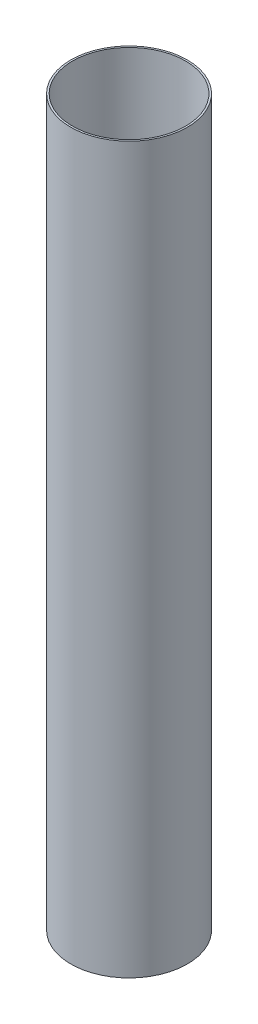
ISO-10303-21;
HEADER;
FILE_DESCRIPTION(('STEP AP214'),'2;1');
FILE_NAME('part.step','',(''),(''),'','','');
FILE_SCHEMA(('AUTOMOTIVE_DESIGN { 1 0 10303 214 1 1 1 1 }'));
ENDSEC;
DATA;
#1=APPLICATION_CONTEXT('core data for automotive mechanical design processes');
#2=APPLICATION_PROTOCOL_DEFINITION('international standard','automotive_design',2000,#1);
#3=PRODUCT_CONTEXT('',#1,'mechanical');
#4=PRODUCT('Part','Part','',(#3));
#5=PRODUCT_RELATED_PRODUCT_CATEGORY('part','',(#4));
#6=PRODUCT_DEFINITION_FORMATION('','',#4);
#7=PRODUCT_DEFINITION_CONTEXT('part definition',#1,'design');
#8=PRODUCT_DEFINITION('design','',#6,#7);
#9=PRODUCT_DEFINITION_SHAPE('','',#8);
#10=(LENGTH_UNIT() NAMED_UNIT(*) SI_UNIT(.MILLI.,.METRE.));
#11=(NAMED_UNIT(*) PLANE_ANGLE_UNIT() SI_UNIT($,.RADIAN.));
#12=(NAMED_UNIT(*) SI_UNIT($,.STERADIAN.) SOLID_ANGLE_UNIT());
#13=UNCERTAINTY_MEASURE_WITH_UNIT(LENGTH_MEASURE(1.E-05),#10,'distance_accuracy_value','');
#14=(GEOMETRIC_REPRESENTATION_CONTEXT(3) GLOBAL_UNCERTAINTY_ASSIGNED_CONTEXT((#13)) GLOBAL_UNIT_ASSIGNED_CONTEXT((#10,
#11,#12)) REPRESENTATION_CONTEXT('',''));
#15=CARTESIAN_POINT('',(0.,0.,0.));
#16=DIRECTION('',(0.,0.,1.));
#17=DIRECTION('',(1.,0.,0.));
#18=AXIS2_PLACEMENT_3D('',#15,#16,#17);
#19=CARTESIAN_POINT('',(0.,635.,0.));
#20=DIRECTION('',(0.,1.,0.));
#21=DIRECTION('',(0.,0.,1.));
#22=AXIS2_PLACEMENT_3D('',#19,#20,#21);
#23=PLANE('',#22);
#24=CARTESIAN_POINT('',(0.,635.,0.));
#25=DIRECTION('',(0.,1.,0.));
#26=DIRECTION('',(0.,0.,1.));
#27=AXIS2_PLACEMENT_3D('',#24,#25,#26);
#28=CIRCLE('',#27,51.1048);
#29=CARTESIAN_POINT('',(0.,635.,-51.1048));
#30=VERTEX_POINT('',#29);
#31=EDGE_CURVE('E10',#30,#30,#28,.T.);
#32=ORIENTED_EDGE('',*,*,#31,.T.);
#33=EDGE_LOOP('',(#32));
#34=FACE_BOUND('',#33,.T.);
#35=CARTESIAN_POINT('',(0.,635.,0.));
#36=DIRECTION('',(0.,1.,0.));
#37=DIRECTION('',(0.,0.,1.));
#38=AXIS2_PLACEMENT_3D('',#35,#36,#37);
#39=CIRCLE('',#38,49.53);
#40=CARTESIAN_POINT('',(0.,635.,-49.53));
#41=VERTEX_POINT('',#40);
#42=EDGE_CURVE('E54',#41,#41,#39,.T.);
#43=ORIENTED_EDGE('',*,*,#42,.F.);
#44=EDGE_LOOP('',(#43));
#45=FACE_BOUND('',#44,.T.);
#46=ADVANCED_FACE('F41',(#34,#45),#23,.T.);
#47=CARTESIAN_POINT('',(0.,0.,0.));
#48=DIRECTION('',(0.,1.,0.));
#49=DIRECTION('',(0.,0.,1.));
#50=AXIS2_PLACEMENT_3D('',#47,#48,#49);
#51=PLANE('',#50);
#52=CARTESIAN_POINT('',(0.,0.,0.));
#53=DIRECTION('',(0.,1.,0.));
#54=DIRECTION('',(0.,0.,1.));
#55=AXIS2_PLACEMENT_3D('',#52,#53,#54);
#56=CIRCLE('',#55,51.1048);
#57=CARTESIAN_POINT('',(0.,-1.11022302462516E-13,-51.1048));
#58=VERTEX_POINT('',#57);
#59=EDGE_CURVE('E45',#58,#58,#56,.T.);
#60=ORIENTED_EDGE('',*,*,#59,.F.);
#61=EDGE_LOOP('',(#60));
#62=FACE_BOUND('',#61,.T.);
#63=CARTESIAN_POINT('',(0.,0.,0.));
#64=DIRECTION('',(0.,1.,0.));
#65=DIRECTION('',(0.,0.,1.));
#66=AXIS2_PLACEMENT_3D('',#63,#64,#65);
#67=CIRCLE('',#66,49.53);
#68=CARTESIAN_POINT('',(0.,-1.11022302462516E-13,-49.53));
#69=VERTEX_POINT('',#68);
#70=EDGE_CURVE('E56',#69,#69,#67,.T.);
#71=ORIENTED_EDGE('',*,*,#70,.T.);
#72=EDGE_LOOP('',(#71));
#73=FACE_BOUND('',#72,.T.);
#74=ADVANCED_FACE('F68',(#62,#73),#51,.F.);
#75=CARTESIAN_POINT('',(0.,635.,0.));
#76=DIRECTION('',(0.,-1.,0.));
#77=DIRECTION('',(0.,0.,-1.));
#78=AXIS2_PLACEMENT_3D('',#75,#76,#77);
#79=CYLINDRICAL_SURFACE('',#78,51.1048);
#80=CARTESIAN_POINT('',(0.,635.,-51.1048));
#81=CARTESIAN_POINT('',(0.,628.385416666667,-51.1048));
#82=CARTESIAN_POINT('',(0.,621.770833333333,-51.1048));
#83=CARTESIAN_POINT('',(0.,608.541666666667,-51.1048));
#84=CARTESIAN_POINT('',(0.,601.927083333333,-51.1048));
#85=CARTESIAN_POINT('',(0.,588.697916666667,-51.1048));
#86=CARTESIAN_POINT('',(0.,582.083333333333,-51.1048));
#87=CARTESIAN_POINT('',(0.,568.854166666667,-51.1048));
#88=CARTESIAN_POINT('',(0.,562.239583333333,-51.1048));
#89=CARTESIAN_POINT('',(0.,549.010416666667,-51.1048));
#90=CARTESIAN_POINT('',(0.,542.395833333333,-51.1048));
#91=CARTESIAN_POINT('',(0.,529.166666666667,-51.1048));
#92=CARTESIAN_POINT('',(0.,522.552083333333,-51.1048));
#93=CARTESIAN_POINT('',(0.,509.322916666667,-51.1048));
#94=CARTESIAN_POINT('',(0.,502.708333333333,-51.1048));
#95=CARTESIAN_POINT('',(0.,489.479166666667,-51.1048));
#96=CARTESIAN_POINT('',(0.,482.864583333333,-51.1048));
#97=CARTESIAN_POINT('',(0.,469.635416666667,-51.1048));
#98=CARTESIAN_POINT('',(0.,463.020833333333,-51.1048));
#99=CARTESIAN_POINT('',(0.,449.791666666667,-51.1048));
#100=CARTESIAN_POINT('',(0.,443.177083333333,-51.1048));
#101=CARTESIAN_POINT('',(0.,429.947916666667,-51.1048));
#102=CARTESIAN_POINT('',(0.,423.333333333333,-51.1048));
#103=CARTESIAN_POINT('',(0.,410.104166666667,-51.1048));
#104=CARTESIAN_POINT('',(0.,403.489583333333,-51.1048));
#105=CARTESIAN_POINT('',(0.,390.260416666667,-51.1048));
#106=CARTESIAN_POINT('',(0.,383.645833333333,-51.1048));
#107=CARTESIAN_POINT('',(0.,370.416666666667,-51.1048));
#108=CARTESIAN_POINT('',(0.,363.802083333333,-51.1048));
#109=CARTESIAN_POINT('',(0.,350.572916666667,-51.1048));
#110=CARTESIAN_POINT('',(0.,343.958333333333,-51.1048));
#111=CARTESIAN_POINT('',(0.,330.729166666667,-51.1048));
#112=CARTESIAN_POINT('',(0.,324.114583333333,-51.1048));
#113=CARTESIAN_POINT('',(0.,310.885416666667,-51.1048));
#114=CARTESIAN_POINT('',(0.,304.270833333333,-51.1048));
#115=CARTESIAN_POINT('',(0.,291.041666666667,-51.1048));
#116=CARTESIAN_POINT('',(0.,284.427083333333,-51.1048));
#117=CARTESIAN_POINT('',(0.,271.197916666667,-51.1048));
#118=CARTESIAN_POINT('',(0.,264.583333333333,-51.1048));
#119=CARTESIAN_POINT('',(0.,251.354166666667,-51.1048));
#120=CARTESIAN_POINT('',(0.,244.739583333333,-51.1048));
#121=CARTESIAN_POINT('',(0.,231.510416666667,-51.1048));
#122=CARTESIAN_POINT('',(0.,224.895833333333,-51.1048));
#123=CARTESIAN_POINT('',(0.,211.666666666667,-51.1048));
#124=CARTESIAN_POINT('',(0.,205.052083333333,-51.1048));
#125=CARTESIAN_POINT('',(0.,191.822916666666,-51.1048));
#126=CARTESIAN_POINT('',(0.,185.208333333333,-51.1048));
#127=CARTESIAN_POINT('',(0.,171.979166666666,-51.1048));
#128=CARTESIAN_POINT('',(0.,165.364583333333,-51.1048));
#129=CARTESIAN_POINT('',(0.,152.135416666666,-51.1048));
#130=CARTESIAN_POINT('',(0.,145.520833333333,-51.1048));
#131=CARTESIAN_POINT('',(0.,132.291666666667,-51.1048));
#132=CARTESIAN_POINT('',(0.,125.677083333333,-51.1048));
#133=CARTESIAN_POINT('',(0.,112.447916666667,-51.1048));
#134=CARTESIAN_POINT('',(0.,105.833333333333,-51.1048));
#135=CARTESIAN_POINT('',(0.,92.6041666666666,-51.1048));
#136=CARTESIAN_POINT('',(0.,85.9895833333332,-51.1048));
#137=CARTESIAN_POINT('',(0.,72.7604166666665,-51.1048));
#138=CARTESIAN_POINT('',(0.,66.1458333333332,-51.1048));
#139=CARTESIAN_POINT('',(0.,52.9166666666666,-51.1048));
#140=CARTESIAN_POINT('',(0.,46.3020833333332,-51.1048));
#141=CARTESIAN_POINT('',(0.,33.0729166666666,-51.1048));
#142=CARTESIAN_POINT('',(0.,26.4583333333333,-51.1048));
#143=CARTESIAN_POINT('',(0.,13.2291666666666,-51.1048));
#144=CARTESIAN_POINT('',(0.,6.61458333333324,-51.1048));
#145=CARTESIAN_POINT('',(0.,-1.11022302462516E-13,-51.1048));
#146=B_SPLINE_CURVE_WITH_KNOTS('',3,(#80,#81,#82,#83,#84,#85,#86,#87,#88,#89,#90,#91,#92,#93,
#94,#95,#96,#97,#98,#99,#100,#101,#102,#103,#104,#105,#106,#107,#108,#109,#110,#111,#112,#113,
#114,#115,#116,#117,#118,#119,#120,#121,#122,#123,#124,#125,#126,#127,#128,#129,#130,#131,#132,
#133,#134,#135,#136,#137,#138,#139,#140,#141,#142,#143,#144,#145),.UNSPECIFIED.,.F.,.F.,(4,2,2,
2,2,2,2,2,2,2,2,2,2,2,2,2,2,2,2,2,2,2,2,2,2,2,2,2,2,2,2,2,4),(0.,19.84375,39.6875000000001,
59.53125,79.3750000000001,99.2187500000001,119.0625,138.90625,158.75,178.59375,198.4375,
218.28125,238.125,257.96875,277.8125,297.65625,317.5,337.34375,357.1875,377.03125,396.875,
416.71875,436.5625,456.40625,476.25,496.09375,515.9375,535.78125,555.625,575.46875,595.3125,
615.15625,635.),.UNSPECIFIED.);
#147=EDGE_CURVE('BSEAM43',#30,#58,#146,.T.);
#148=ORIENTED_EDGE('',*,*,#31,.F.);
#149=ORIENTED_EDGE('',*,*,#59,.T.);
#150=ORIENTED_EDGE('',*,*,#147,.T.);
#151=ORIENTED_EDGE('',*,*,#147,.F.);
#152=EDGE_LOOP('',(#148,#150,#149,#151));
#153=FACE_BOUND('',#152,.T.);
#154=ADVANCED_FACE('F43',(#153),#79,.T.);
#155=CARTESIAN_POINT('',(0.,635.,0.));
#156=DIRECTION('',(0.,-1.,0.));
#157=DIRECTION('',(0.,0.,-1.));
#158=AXIS2_PLACEMENT_3D('',#155,#156,#157);
#159=CYLINDRICAL_SURFACE('',#158,49.53);
#160=CARTESIAN_POINT('',(0.,635.,-49.53));
#161=CARTESIAN_POINT('',(0.,628.385416666667,-49.53));
#162=CARTESIAN_POINT('',(0.,621.770833333333,-49.53));
#163=CARTESIAN_POINT('',(0.,608.541666666667,-49.53));
#164=CARTESIAN_POINT('',(0.,601.927083333333,-49.53));
#165=CARTESIAN_POINT('',(0.,588.697916666667,-49.53));
#166=CARTESIAN_POINT('',(0.,582.083333333333,-49.53));
#167=CARTESIAN_POINT('',(0.,568.854166666667,-49.53));
#168=CARTESIAN_POINT('',(0.,562.239583333333,-49.53));
#169=CARTESIAN_POINT('',(0.,549.010416666667,-49.53));
#170=CARTESIAN_POINT('',(0.,542.395833333333,-49.53));
#171=CARTESIAN_POINT('',(0.,529.166666666667,-49.53));
#172=CARTESIAN_POINT('',(0.,522.552083333333,-49.53));
#173=CARTESIAN_POINT('',(0.,509.322916666667,-49.53));
#174=CARTESIAN_POINT('',(0.,502.708333333333,-49.53));
#175=CARTESIAN_POINT('',(0.,489.479166666667,-49.53));
#176=CARTESIAN_POINT('',(0.,482.864583333333,-49.53));
#177=CARTESIAN_POINT('',(0.,469.635416666667,-49.53));
#178=CARTESIAN_POINT('',(0.,463.020833333333,-49.53));
#179=CARTESIAN_POINT('',(0.,449.791666666667,-49.53));
#180=CARTESIAN_POINT('',(0.,443.177083333333,-49.53));
#181=CARTESIAN_POINT('',(0.,429.947916666667,-49.53));
#182=CARTESIAN_POINT('',(0.,423.333333333333,-49.53));
#183=CARTESIAN_POINT('',(0.,410.104166666667,-49.53));
#184=CARTESIAN_POINT('',(0.,403.489583333333,-49.53));
#185=CARTESIAN_POINT('',(0.,390.260416666667,-49.53));
#186=CARTESIAN_POINT('',(0.,383.645833333333,-49.53));
#187=CARTESIAN_POINT('',(0.,370.416666666667,-49.53));
#188=CARTESIAN_POINT('',(0.,363.802083333333,-49.53));
#189=CARTESIAN_POINT('',(0.,350.572916666667,-49.53));
#190=CARTESIAN_POINT('',(0.,343.958333333333,-49.53));
#191=CARTESIAN_POINT('',(0.,330.729166666667,-49.53));
#192=CARTESIAN_POINT('',(0.,324.114583333333,-49.53));
#193=CARTESIAN_POINT('',(0.,310.885416666667,-49.53));
#194=CARTESIAN_POINT('',(0.,304.270833333333,-49.53));
#195=CARTESIAN_POINT('',(0.,291.041666666667,-49.53));
#196=CARTESIAN_POINT('',(0.,284.427083333333,-49.53));
#197=CARTESIAN_POINT('',(0.,271.197916666667,-49.53));
#198=CARTESIAN_POINT('',(0.,264.583333333333,-49.53));
#199=CARTESIAN_POINT('',(0.,251.354166666667,-49.53));
#200=CARTESIAN_POINT('',(0.,244.739583333333,-49.53));
#201=CARTESIAN_POINT('',(0.,231.510416666667,-49.53));
#202=CARTESIAN_POINT('',(0.,224.895833333333,-49.53));
#203=CARTESIAN_POINT('',(0.,211.666666666667,-49.53));
#204=CARTESIAN_POINT('',(0.,205.052083333333,-49.53));
#205=CARTESIAN_POINT('',(0.,191.822916666666,-49.53));
#206=CARTESIAN_POINT('',(0.,185.208333333333,-49.53));
#207=CARTESIAN_POINT('',(0.,171.979166666666,-49.53));
#208=CARTESIAN_POINT('',(0.,165.364583333333,-49.53));
#209=CARTESIAN_POINT('',(0.,152.135416666666,-49.53));
#210=CARTESIAN_POINT('',(0.,145.520833333333,-49.53));
#211=CARTESIAN_POINT('',(0.,132.291666666667,-49.53));
#212=CARTESIAN_POINT('',(0.,125.677083333333,-49.53));
#213=CARTESIAN_POINT('',(0.,112.447916666667,-49.53));
#214=CARTESIAN_POINT('',(0.,105.833333333333,-49.53));
#215=CARTESIAN_POINT('',(0.,92.6041666666666,-49.53));
#216=CARTESIAN_POINT('',(0.,85.9895833333332,-49.53));
#217=CARTESIAN_POINT('',(0.,72.7604166666665,-49.53));
#218=CARTESIAN_POINT('',(0.,66.1458333333332,-49.53));
#219=CARTESIAN_POINT('',(0.,52.9166666666666,-49.53));
#220=CARTESIAN_POINT('',(0.,46.3020833333332,-49.53));
#221=CARTESIAN_POINT('',(0.,33.0729166666666,-49.53));
#222=CARTESIAN_POINT('',(0.,26.4583333333333,-49.53));
#223=CARTESIAN_POINT('',(0.,13.2291666666666,-49.53));
#224=CARTESIAN_POINT('',(0.,6.61458333333324,-49.53));
#225=CARTESIAN_POINT('',(0.,-1.11022302462516E-13,-49.53));
#226=B_SPLINE_CURVE_WITH_KNOTS('',3,(#160,#161,#162,#163,#164,#165,#166,#167,#168,#169,#170,
#171,#172,#173,#174,#175,#176,#177,#178,#179,#180,#181,#182,#183,#184,#185,#186,#187,#188,#189,
#190,#191,#192,#193,#194,#195,#196,#197,#198,#199,#200,#201,#202,#203,#204,#205,#206,#207,#208,
#209,#210,#211,#212,#213,#214,#215,#216,#217,#218,#219,#220,#221,#222,#223,#224,#225),
.UNSPECIFIED.,.F.,.F.,(4,2,2,2,2,2,2,2,2,2,2,2,2,2,2,2,2,2,2,2,2,2,2,2,2,2,2,2,2,2,2,2,4),(0.,
19.84375,39.6875000000001,59.53125,79.3750000000001,99.2187500000001,119.0625,138.90625,158.75,
178.59375,198.4375,218.28125,238.125,257.96875,277.8125,297.65625,317.5,337.34375,357.1875,
377.03125,396.875,416.71875,436.5625,456.40625,476.25,496.09375,515.9375,535.78125,555.625,
575.46875,595.3125,615.15625,635.),.UNSPECIFIED.);
#227=EDGE_CURVE('BSEAM64',#41,#69,#226,.T.);
#228=ORIENTED_EDGE('',*,*,#42,.T.);
#229=ORIENTED_EDGE('',*,*,#70,.F.);
#230=ORIENTED_EDGE('',*,*,#227,.T.);
#231=ORIENTED_EDGE('',*,*,#227,.F.);
#232=EDGE_LOOP('',(#228,#230,#229,#231));
#233=FACE_BOUND('',#232,.T.);
#234=ADVANCED_FACE('F64',(#233),#159,.F.);
#235=CLOSED_SHELL('',(#46,#74,#154,#234));
#236=MANIFOLD_SOLID_BREP('B2',#235);
#237=ADVANCED_BREP_SHAPE_REPRESENTATION('',(#18,#236),#14);
#238=SHAPE_DEFINITION_REPRESENTATION(#9,#237);
ENDSEC;
END-ISO-10303-21;
